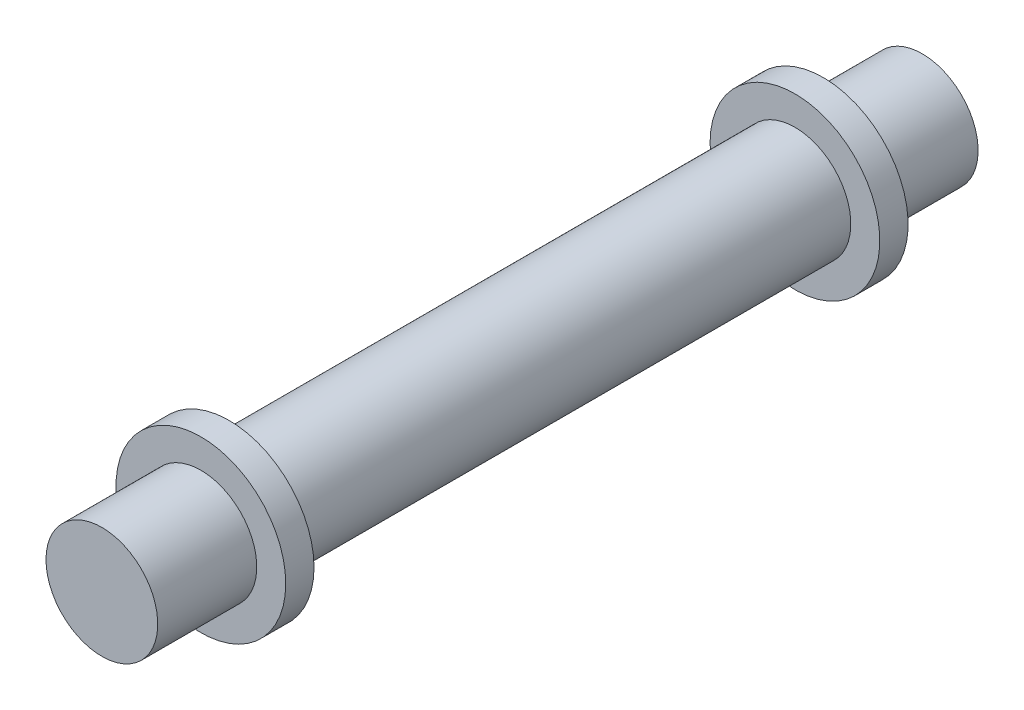
ISO-10303-21;
HEADER;
FILE_DESCRIPTION(('STEP AP214'),'2;1');
FILE_NAME('part.step','',(''),(''),'','','');
FILE_SCHEMA(('AUTOMOTIVE_DESIGN { 1 0 10303 214 1 1 1 1 }'));
ENDSEC;
DATA;
#1=APPLICATION_CONTEXT('core data for automotive mechanical design processes');
#2=APPLICATION_PROTOCOL_DEFINITION('international standard','automotive_design',2000,#1);
#3=PRODUCT_CONTEXT('',#1,'mechanical');
#4=PRODUCT('Part','Part','',(#3));
#5=PRODUCT_RELATED_PRODUCT_CATEGORY('part','',(#4));
#6=PRODUCT_DEFINITION_FORMATION('','',#4);
#7=PRODUCT_DEFINITION_CONTEXT('part definition',#1,'design');
#8=PRODUCT_DEFINITION('design','',#6,#7);
#9=PRODUCT_DEFINITION_SHAPE('','',#8);
#10=(LENGTH_UNIT() NAMED_UNIT(*) SI_UNIT(.MILLI.,.METRE.));
#11=(NAMED_UNIT(*) PLANE_ANGLE_UNIT() SI_UNIT($,.RADIAN.));
#12=(NAMED_UNIT(*) SI_UNIT($,.STERADIAN.) SOLID_ANGLE_UNIT());
#13=UNCERTAINTY_MEASURE_WITH_UNIT(LENGTH_MEASURE(1.E-05),#10,'distance_accuracy_value','');
#14=(GEOMETRIC_REPRESENTATION_CONTEXT(3) GLOBAL_UNCERTAINTY_ASSIGNED_CONTEXT((#13)) GLOBAL_UNIT_ASSIGNED_CONTEXT((#10,
#11,#12)) REPRESENTATION_CONTEXT('',''));
#15=CARTESIAN_POINT('',(0.,0.,0.));
#16=DIRECTION('',(0.,0.,1.));
#17=DIRECTION('',(1.,0.,0.));
#18=AXIS2_PLACEMENT_3D('',#15,#16,#17);
#19=CARTESIAN_POINT('',(0.,0.,58.));
#20=DIRECTION('',(0.,0.,-1.));
#21=DIRECTION('',(-1.,0.,0.));
#22=AXIS2_PLACEMENT_3D('',#19,#20,#21);
#23=CYLINDRICAL_SURFACE('',#22,3.95);
#24=CARTESIAN_POINT('',(0.,0.,49.));
#25=DIRECTION('',(0.,0.,1.));
#26=DIRECTION('',(1.,0.,0.));
#27=AXIS2_PLACEMENT_3D('',#24,#25,#26);
#28=CIRCLE('',#27,3.95);
#29=CARTESIAN_POINT('',(-3.95,0.,49.));
#30=VERTEX_POINT('',#29);
#31=EDGE_CURVE('E39',#30,#30,#28,.T.);
#32=CARTESIAN_POINT('',(0.,0.,9.));
#33=DIRECTION('',(0.,0.,-1.));
#34=DIRECTION('',(-1.,0.,0.));
#35=AXIS2_PLACEMENT_3D('',#32,#33,#34);
#36=CIRCLE('',#35,3.95);
#37=CARTESIAN_POINT('',(-3.95,0.,9.00000000000001));
#38=VERTEX_POINT('',#37);
#39=EDGE_CURVE('E10',#38,#38,#36,.T.);
#40=CARTESIAN_POINT('',(-3.95,0.,49.));
#41=CARTESIAN_POINT('',(-3.95,0.,48.5833333333333));
#42=CARTESIAN_POINT('',(-3.95,0.,48.1666666666667));
#43=CARTESIAN_POINT('',(-3.95,0.,47.3333333333333));
#44=CARTESIAN_POINT('',(-3.95,0.,46.9166666666667));
#45=CARTESIAN_POINT('',(-3.95,0.,46.0833333333333));
#46=CARTESIAN_POINT('',(-3.95,0.,45.6666666666667));
#47=CARTESIAN_POINT('',(-3.95,0.,44.8333333333333));
#48=CARTESIAN_POINT('',(-3.95,0.,44.4166666666667));
#49=CARTESIAN_POINT('',(-3.95,0.,43.5833333333333));
#50=CARTESIAN_POINT('',(-3.95,0.,43.1666666666667));
#51=CARTESIAN_POINT('',(-3.95,0.,42.3333333333333));
#52=CARTESIAN_POINT('',(-3.95,0.,41.9166666666667));
#53=CARTESIAN_POINT('',(-3.95,0.,41.0833333333333));
#54=CARTESIAN_POINT('',(-3.95,0.,40.6666666666667));
#55=CARTESIAN_POINT('',(-3.95,0.,39.8333333333333));
#56=CARTESIAN_POINT('',(-3.95,0.,39.4166666666667));
#57=CARTESIAN_POINT('',(-3.95,0.,38.5833333333333));
#58=CARTESIAN_POINT('',(-3.95,0.,38.1666666666667));
#59=CARTESIAN_POINT('',(-3.95,0.,37.3333333333333));
#60=CARTESIAN_POINT('',(-3.95,0.,36.9166666666667));
#61=CARTESIAN_POINT('',(-3.95,0.,36.0833333333333));
#62=CARTESIAN_POINT('',(-3.95,0.,35.6666666666667));
#63=CARTESIAN_POINT('',(-3.95,0.,34.8333333333333));
#64=CARTESIAN_POINT('',(-3.95,0.,34.4166666666667));
#65=CARTESIAN_POINT('',(-3.95,0.,33.5833333333333));
#66=CARTESIAN_POINT('',(-3.95,0.,33.1666666666667));
#67=CARTESIAN_POINT('',(-3.95,0.,32.3333333333333));
#68=CARTESIAN_POINT('',(-3.95,0.,31.9166666666667));
#69=CARTESIAN_POINT('',(-3.95,0.,31.0833333333333));
#70=CARTESIAN_POINT('',(-3.95,0.,30.6666666666667));
#71=CARTESIAN_POINT('',(-3.95,0.,29.8333333333333));
#72=CARTESIAN_POINT('',(-3.95,0.,29.4166666666667));
#73=CARTESIAN_POINT('',(-3.95,0.,28.5833333333333));
#74=CARTESIAN_POINT('',(-3.95,0.,28.1666666666667));
#75=CARTESIAN_POINT('',(-3.95,0.,27.3333333333333));
#76=CARTESIAN_POINT('',(-3.95,0.,26.9166666666667));
#77=CARTESIAN_POINT('',(-3.95,0.,26.0833333333333));
#78=CARTESIAN_POINT('',(-3.95,0.,25.6666666666667));
#79=CARTESIAN_POINT('',(-3.95,0.,24.8333333333333));
#80=CARTESIAN_POINT('',(-3.95,0.,24.4166666666667));
#81=CARTESIAN_POINT('',(-3.95,0.,23.5833333333333));
#82=CARTESIAN_POINT('',(-3.95,0.,23.1666666666667));
#83=CARTESIAN_POINT('',(-3.95,0.,22.3333333333333));
#84=CARTESIAN_POINT('',(-3.95,0.,21.9166666666667));
#85=CARTESIAN_POINT('',(-3.95,0.,21.0833333333333));
#86=CARTESIAN_POINT('',(-3.95,0.,20.6666666666667));
#87=CARTESIAN_POINT('',(-3.95,0.,19.8333333333333));
#88=CARTESIAN_POINT('',(-3.95,0.,19.4166666666667));
#89=CARTESIAN_POINT('',(-3.95,0.,18.5833333333333));
#90=CARTESIAN_POINT('',(-3.95,0.,18.1666666666667));
#91=CARTESIAN_POINT('',(-3.95,0.,17.3333333333333));
#92=CARTESIAN_POINT('',(-3.95,0.,16.9166666666667));
#93=CARTESIAN_POINT('',(-3.95,0.,16.0833333333333));
#94=CARTESIAN_POINT('',(-3.95,0.,15.6666666666667));
#95=CARTESIAN_POINT('',(-3.95,0.,14.8333333333333));
#96=CARTESIAN_POINT('',(-3.95,0.,14.4166666666667));
#97=CARTESIAN_POINT('',(-3.95,0.,13.5833333333333));
#98=CARTESIAN_POINT('',(-3.95,0.,13.1666666666667));
#99=CARTESIAN_POINT('',(-3.95,0.,12.3333333333333));
#100=CARTESIAN_POINT('',(-3.95,0.,11.9166666666667));
#101=CARTESIAN_POINT('',(-3.95,0.,11.0833333333333));
#102=CARTESIAN_POINT('',(-3.95,0.,10.6666666666667));
#103=CARTESIAN_POINT('',(-3.95,0.,9.83333333333334));
#104=CARTESIAN_POINT('',(-3.95,0.,9.41666666666667));
#105=CARTESIAN_POINT('',(-3.95,0.,9.00000000000001));
#106=B_SPLINE_CURVE_WITH_KNOTS('',3,(#40,#41,#42,#43,#44,#45,#46,#47,#48,#49,#50,#51,#52,#53,
#54,#55,#56,#57,#58,#59,#60,#61,#62,#63,#64,#65,#66,#67,#68,#69,#70,#71,#72,#73,#74,#75,#76,#77,
#78,#79,#80,#81,#82,#83,#84,#85,#86,#87,#88,#89,#90,#91,#92,#93,#94,#95,#96,#97,#98,#99,#100,
#101,#102,#103,#104,#105),.UNSPECIFIED.,.F.,.F.,(4,2,2,2,2,2,2,2,2,2,2,2,2,2,2,2,2,2,2,2,2,2,2,
2,2,2,2,2,2,2,2,2,4),(0.,1.24999999999999,2.5,3.75,5.,6.25,7.5,8.75,9.99999999999999,11.25,12.5,
13.75,15.,16.25,17.5,18.75,20.,21.25,22.5,23.75,25.,26.25,27.5,28.75,30.,31.25,32.5,33.75,35.,
36.25,37.5,38.75,40.),.UNSPECIFIED.);
#107=EDGE_CURVE('BSEAM32',#30,#38,#106,.T.);
#108=ORIENTED_EDGE('',*,*,#31,.F.);
#109=ORIENTED_EDGE('',*,*,#39,.F.);
#110=ORIENTED_EDGE('',*,*,#107,.T.);
#111=ORIENTED_EDGE('',*,*,#107,.F.);
#112=EDGE_LOOP('',(#108,#110,#109,#111));
#113=FACE_BOUND('',#112,.T.);
#114=ADVANCED_FACE('F32',(#113),#23,.T.);
#115=CARTESIAN_POINT('',(0.,0.,49.));
#116=DIRECTION('',(0.,0.,1.));
#117=DIRECTION('',(1.,0.,0.));
#118=AXIS2_PLACEMENT_3D('',#115,#116,#117);
#119=CYLINDRICAL_SURFACE('',#118,6.);
#120=CARTESIAN_POINT('',(0.,0.,49.));
#121=DIRECTION('',(0.,0.,1.));
#122=DIRECTION('',(1.,0.,0.));
#123=AXIS2_PLACEMENT_3D('',#120,#121,#122);
#124=CIRCLE('',#123,6.);
#125=CARTESIAN_POINT('',(6.,0.,49.));
#126=VERTEX_POINT('',#125);
#127=EDGE_CURVE('E60',#126,#126,#124,.T.);
#128=ORIENTED_EDGE('',*,*,#127,.T.);
#129=EDGE_LOOP('',(#128));
#130=FACE_BOUND('',#129,.T.);
#131=CARTESIAN_POINT('',(0.,0.,51.));
#132=DIRECTION('',(0.,0.,1.));
#133=DIRECTION('',(1.,0.,0.));
#134=AXIS2_PLACEMENT_3D('',#131,#132,#133);
#135=CIRCLE('',#134,6.);
#136=CARTESIAN_POINT('',(6.,0.,51.));
#137=VERTEX_POINT('',#136);
#138=EDGE_CURVE('E55',#137,#137,#135,.T.);
#139=ORIENTED_EDGE('',*,*,#138,.F.);
#140=EDGE_LOOP('',(#139));
#141=FACE_BOUND('',#140,.T.);
#142=ADVANCED_FACE('F87',(#130,#141),#119,.T.);
#143=CARTESIAN_POINT('',(0.,0.,49.));
#144=DIRECTION('',(0.,0.,1.));
#145=DIRECTION('',(1.,0.,0.));
#146=AXIS2_PLACEMENT_3D('',#143,#144,#145);
#147=PLANE('',#146);
#148=ORIENTED_EDGE('',*,*,#31,.T.);
#149=EDGE_LOOP('',(#148));
#150=FACE_BOUND('',#149,.T.);
#151=ORIENTED_EDGE('',*,*,#127,.F.);
#152=EDGE_LOOP('',(#151));
#153=FACE_BOUND('',#152,.T.);
#154=ADVANCED_FACE('F83',(#150,#153),#147,.F.);
#155=CARTESIAN_POINT('',(0.,0.,51.));
#156=DIRECTION('',(0.,0.,1.));
#157=DIRECTION('',(1.,0.,0.));
#158=AXIS2_PLACEMENT_3D('',#155,#156,#157);
#159=PLANE('',#158);
#160=CARTESIAN_POINT('',(0.,0.,51.));
#161=DIRECTION('',(0.,0.,1.));
#162=DIRECTION('',(1.,0.,0.));
#163=AXIS2_PLACEMENT_3D('',#160,#161,#162);
#164=CIRCLE('',#163,3.95);
#165=CARTESIAN_POINT('',(-3.95,0.,51.));
#166=VERTEX_POINT('',#165);
#167=EDGE_CURVE('E51',#166,#166,#164,.T.);
#168=ORIENTED_EDGE('',*,*,#167,.F.);
#169=EDGE_LOOP('',(#168));
#170=FACE_BOUND('',#169,.T.);
#171=ORIENTED_EDGE('',*,*,#138,.T.);
#172=EDGE_LOOP('',(#171));
#173=FACE_BOUND('',#172,.T.);
#174=ADVANCED_FACE('F79',(#170,#173),#159,.T.);
#175=CARTESIAN_POINT('',(0.,0.,58.));
#176=DIRECTION('',(0.,0.,1.));
#177=DIRECTION('',(1.,0.,0.));
#178=AXIS2_PLACEMENT_3D('',#175,#176,#177);
#179=PLANE('',#178);
#180=CARTESIAN_POINT('',(0.,0.,58.));
#181=DIRECTION('',(0.,0.,1.));
#182=DIRECTION('',(1.,0.,0.));
#183=AXIS2_PLACEMENT_3D('',#180,#181,#182);
#184=CIRCLE('',#183,3.95);
#185=CARTESIAN_POINT('',(-3.95,0.,58.));
#186=VERTEX_POINT('',#185);
#187=EDGE_CURVE('E43',#186,#186,#184,.T.);
#188=ORIENTED_EDGE('',*,*,#187,.T.);
#189=EDGE_LOOP('',(#188));
#190=FACE_BOUND('',#189,.T.);
#191=ADVANCED_FACE('F82',(#190),#179,.T.);
#192=CARTESIAN_POINT('',(-3.95,0.,51.));
#193=CARTESIAN_POINT('',(-3.95,0.,51.0729166666667));
#194=CARTESIAN_POINT('',(-3.95,0.,51.1458333333333));
#195=CARTESIAN_POINT('',(-3.95,0.,51.2916666666667));
#196=CARTESIAN_POINT('',(-3.95,0.,51.3645833333333));
#197=CARTESIAN_POINT('',(-3.95,0.,51.5104166666667));
#198=CARTESIAN_POINT('',(-3.95,0.,51.5833333333333));
#199=CARTESIAN_POINT('',(-3.95,0.,51.7291666666667));
#200=CARTESIAN_POINT('',(-3.95,0.,51.8020833333333));
#201=CARTESIAN_POINT('',(-3.95,0.,51.9479166666667));
#202=CARTESIAN_POINT('',(-3.95,0.,52.0208333333333));
#203=CARTESIAN_POINT('',(-3.95,0.,52.1666666666667));
#204=CARTESIAN_POINT('',(-3.95,0.,52.2395833333333));
#205=CARTESIAN_POINT('',(-3.95,0.,52.3854166666667));
#206=CARTESIAN_POINT('',(-3.95,0.,52.4583333333333));
#207=CARTESIAN_POINT('',(-3.95,0.,52.6041666666667));
#208=CARTESIAN_POINT('',(-3.95,0.,52.6770833333333));
#209=CARTESIAN_POINT('',(-3.95,0.,52.8229166666667));
#210=CARTESIAN_POINT('',(-3.95,0.,52.8958333333333));
#211=CARTESIAN_POINT('',(-3.95,0.,53.0416666666667));
#212=CARTESIAN_POINT('',(-3.95,0.,53.1145833333333));
#213=CARTESIAN_POINT('',(-3.95,0.,53.2604166666667));
#214=CARTESIAN_POINT('',(-3.95,0.,53.3333333333333));
#215=CARTESIAN_POINT('',(-3.95,0.,53.4791666666667));
#216=CARTESIAN_POINT('',(-3.95,0.,53.5520833333333));
#217=CARTESIAN_POINT('',(-3.95,0.,53.6979166666667));
#218=CARTESIAN_POINT('',(-3.95,0.,53.7708333333333));
#219=CARTESIAN_POINT('',(-3.95,0.,53.9166666666667));
#220=CARTESIAN_POINT('',(-3.95,0.,53.9895833333333));
#221=CARTESIAN_POINT('',(-3.95,0.,54.1354166666667));
#222=CARTESIAN_POINT('',(-3.95,0.,54.2083333333333));
#223=CARTESIAN_POINT('',(-3.95,0.,54.3541666666667));
#224=CARTESIAN_POINT('',(-3.95,0.,54.4270833333333));
#225=CARTESIAN_POINT('',(-3.95,0.,54.5729166666667));
#226=CARTESIAN_POINT('',(-3.95,0.,54.6458333333333));
#227=CARTESIAN_POINT('',(-3.95,0.,54.7916666666667));
#228=CARTESIAN_POINT('',(-3.95,0.,54.8645833333333));
#229=CARTESIAN_POINT('',(-3.95,0.,55.0104166666667));
#230=CARTESIAN_POINT('',(-3.95,0.,55.0833333333333));
#231=CARTESIAN_POINT('',(-3.95,0.,55.2291666666667));
#232=CARTESIAN_POINT('',(-3.95,0.,55.3020833333333));
#233=CARTESIAN_POINT('',(-3.95,0.,55.4479166666667));
#234=CARTESIAN_POINT('',(-3.95,0.,55.5208333333333));
#235=CARTESIAN_POINT('',(-3.95,0.,55.6666666666667));
#236=CARTESIAN_POINT('',(-3.95,0.,55.7395833333333));
#237=CARTESIAN_POINT('',(-3.95,0.,55.8854166666667));
#238=CARTESIAN_POINT('',(-3.95,0.,55.9583333333333));
#239=CARTESIAN_POINT('',(-3.95,0.,56.1041666666667));
#240=CARTESIAN_POINT('',(-3.95,0.,56.1770833333333));
#241=CARTESIAN_POINT('',(-3.95,0.,56.3229166666667));
#242=CARTESIAN_POINT('',(-3.95,0.,56.3958333333333));
#243=CARTESIAN_POINT('',(-3.95,0.,56.5416666666667));
#244=CARTESIAN_POINT('',(-3.95,0.,56.6145833333333));
#245=CARTESIAN_POINT('',(-3.95,0.,56.7604166666667));
#246=CARTESIAN_POINT('',(-3.95,0.,56.8333333333333));
#247=CARTESIAN_POINT('',(-3.95,0.,56.9791666666667));
#248=CARTESIAN_POINT('',(-3.95,0.,57.0520833333333));
#249=CARTESIAN_POINT('',(-3.95,0.,57.1979166666667));
#250=CARTESIAN_POINT('',(-3.95,0.,57.2708333333333));
#251=CARTESIAN_POINT('',(-3.95,0.,57.4166666666667));
#252=CARTESIAN_POINT('',(-3.95,0.,57.4895833333333));
#253=CARTESIAN_POINT('',(-3.95,0.,57.6354166666667));
#254=CARTESIAN_POINT('',(-3.95,0.,57.7083333333333));
#255=CARTESIAN_POINT('',(-3.95,0.,57.8541666666667));
#256=CARTESIAN_POINT('',(-3.95,0.,57.9270833333333));
#257=CARTESIAN_POINT('',(-3.95,0.,58.));
#258=B_SPLINE_CURVE_WITH_KNOTS('',3,(#192,#193,#194,#195,#196,#197,#198,#199,#200,#201,#202,
#203,#204,#205,#206,#207,#208,#209,#210,#211,#212,#213,#214,#215,#216,#217,#218,#219,#220,#221,
#222,#223,#224,#225,#226,#227,#228,#229,#230,#231,#232,#233,#234,#235,#236,#237,#238,#239,#240,
#241,#242,#243,#244,#245,#246,#247,#248,#249,#250,#251,#252,#253,#254,#255,#256,#257),
.UNSPECIFIED.,.F.,.F.,(4,2,2,2,2,2,2,2,2,2,2,2,2,2,2,2,2,2,2,2,2,2,2,2,2,2,2,2,2,2,2,2,4),(0.,
0.218750000000004,0.4375,0.656250000000004,0.875000000000001,1.09375,1.3125,1.53125,1.75,
1.96875000000001,2.1875,2.40625000000001,2.625,2.84375000000001,3.0625,3.28125,3.5,3.71875,
3.9375,4.15625,4.375,4.59375,4.8125,5.03125,5.25,5.46875,5.68750000000001,5.90625,
6.12500000000001,6.34375,6.56250000000001,6.78125,7.00000000000001),.UNSPECIFIED.);
#259=EDGE_CURVE('BSEAM34',#166,#186,#258,.T.);
#260=ORIENTED_EDGE('',*,*,#167,.T.);
#261=ORIENTED_EDGE('',*,*,#187,.F.);
#262=ORIENTED_EDGE('',*,*,#259,.T.);
#263=ORIENTED_EDGE('',*,*,#259,.F.);
#264=EDGE_LOOP('',(#260,#262,#261,#263));
#265=FACE_BOUND('',#264,.T.);
#266=ADVANCED_FACE('F34',(#265),#23,.T.);
#267=CARTESIAN_POINT('',(0.,0.,9.));
#268=DIRECTION('',(0.,0.,-1.));
#269=DIRECTION('',(-1.,0.,0.));
#270=AXIS2_PLACEMENT_3D('',#267,#268,#269);
#271=CYLINDRICAL_SURFACE('',#270,6.);
#272=CARTESIAN_POINT('',(0.,0.,9.));
#273=DIRECTION('',(0.,0.,-1.));
#274=DIRECTION('',(-1.,0.,0.));
#275=AXIS2_PLACEMENT_3D('',#272,#273,#274);
#276=CIRCLE('',#275,6.);
#277=CARTESIAN_POINT('',(-6.,0.,9.));
#278=VERTEX_POINT('',#277);
#279=EDGE_CURVE('E56',#278,#278,#276,.T.);
#280=ORIENTED_EDGE('',*,*,#279,.T.);
#281=EDGE_LOOP('',(#280));
#282=FACE_BOUND('',#281,.T.);
#283=CARTESIAN_POINT('',(0.,0.,7.));
#284=DIRECTION('',(0.,0.,-1.));
#285=DIRECTION('',(-1.,0.,0.));
#286=AXIS2_PLACEMENT_3D('',#283,#284,#285);
#287=CIRCLE('',#286,6.);
#288=CARTESIAN_POINT('',(-6.,0.,7.));
#289=VERTEX_POINT('',#288);
#290=EDGE_CURVE('E63',#289,#289,#287,.T.);
#291=ORIENTED_EDGE('',*,*,#290,.F.);
#292=EDGE_LOOP('',(#291));
#293=FACE_BOUND('',#292,.T.);
#294=ADVANCED_FACE('F115',(#282,#293),#271,.T.);
#295=CARTESIAN_POINT('',(0.,0.,9.));
#296=DIRECTION('',(0.,0.,-1.));
#297=DIRECTION('',(-1.,0.,0.));
#298=AXIS2_PLACEMENT_3D('',#295,#296,#297);
#299=PLANE('',#298);
#300=ORIENTED_EDGE('',*,*,#39,.T.);
#301=EDGE_LOOP('',(#300));
#302=FACE_BOUND('',#301,.T.);
#303=ORIENTED_EDGE('',*,*,#279,.F.);
#304=EDGE_LOOP('',(#303));
#305=FACE_BOUND('',#304,.T.);
#306=ADVANCED_FACE('F109',(#302,#305),#299,.F.);
#307=CARTESIAN_POINT('',(0.,0.,7.));
#308=DIRECTION('',(0.,0.,-1.));
#309=DIRECTION('',(-1.,0.,0.));
#310=AXIS2_PLACEMENT_3D('',#307,#308,#309);
#311=PLANE('',#310);
#312=CARTESIAN_POINT('',(0.,0.,7.));
#313=DIRECTION('',(0.,0.,-1.));
#314=DIRECTION('',(-1.,0.,0.));
#315=AXIS2_PLACEMENT_3D('',#312,#313,#314);
#316=CIRCLE('',#315,3.95);
#317=CARTESIAN_POINT('',(-3.95,0.,7.00000000000001));
#318=VERTEX_POINT('',#317);
#319=EDGE_CURVE('E53',#318,#318,#316,.T.);
#320=ORIENTED_EDGE('',*,*,#319,.F.);
#321=EDGE_LOOP('',(#320));
#322=FACE_BOUND('',#321,.T.);
#323=ORIENTED_EDGE('',*,*,#290,.T.);
#324=EDGE_LOOP('',(#323));
#325=FACE_BOUND('',#324,.T.);
#326=ADVANCED_FACE('F103',(#322,#325),#311,.T.);
#327=CARTESIAN_POINT('',(0.,0.,0.));
#328=DIRECTION('',(0.,0.,1.));
#329=DIRECTION('',(1.,0.,0.));
#330=AXIS2_PLACEMENT_3D('',#327,#328,#329);
#331=PLANE('',#330);
#332=CARTESIAN_POINT('',(0.,0.,0.));
#333=DIRECTION('',(0.,0.,1.));
#334=DIRECTION('',(1.,0.,0.));
#335=AXIS2_PLACEMENT_3D('',#332,#333,#334);
#336=CIRCLE('',#335,3.95);
#337=CARTESIAN_POINT('',(-3.95,0.,0.));
#338=VERTEX_POINT('',#337);
#339=EDGE_CURVE('E48',#338,#338,#336,.T.);
#340=ORIENTED_EDGE('',*,*,#339,.F.);
#341=EDGE_LOOP('',(#340));
#342=FACE_BOUND('',#341,.T.);
#343=ADVANCED_FACE('F101',(#342),#331,.F.);
#344=CARTESIAN_POINT('',(-3.95,0.,7.00000000000001));
#345=CARTESIAN_POINT('',(-3.95,0.,6.92708333333334));
#346=CARTESIAN_POINT('',(-3.95,0.,6.85416666666667));
#347=CARTESIAN_POINT('',(-3.95,0.,6.70833333333334));
#348=CARTESIAN_POINT('',(-3.95,0.,6.63541666666667));
#349=CARTESIAN_POINT('',(-3.95,0.,6.48958333333334));
#350=CARTESIAN_POINT('',(-3.95,0.,6.41666666666667));
#351=CARTESIAN_POINT('',(-3.95,0.,6.27083333333334));
#352=CARTESIAN_POINT('',(-3.95,0.,6.19791666666667));
#353=CARTESIAN_POINT('',(-3.95,0.,6.05208333333334));
#354=CARTESIAN_POINT('',(-3.95,0.,5.97916666666667));
#355=CARTESIAN_POINT('',(-3.95,0.,5.83333333333334));
#356=CARTESIAN_POINT('',(-3.95,0.,5.76041666666667));
#357=CARTESIAN_POINT('',(-3.95,0.,5.61458333333334));
#358=CARTESIAN_POINT('',(-3.95,0.,5.54166666666667));
#359=CARTESIAN_POINT('',(-3.95,0.,5.39583333333334));
#360=CARTESIAN_POINT('',(-3.95,0.,5.32291666666667));
#361=CARTESIAN_POINT('',(-3.95,0.,5.17708333333334));
#362=CARTESIAN_POINT('',(-3.95,0.,5.10416666666667));
#363=CARTESIAN_POINT('',(-3.95,0.,4.95833333333334));
#364=CARTESIAN_POINT('',(-3.95,0.,4.88541666666667));
#365=CARTESIAN_POINT('',(-3.95,0.,4.73958333333334));
#366=CARTESIAN_POINT('',(-3.95,0.,4.66666666666667));
#367=CARTESIAN_POINT('',(-3.95,0.,4.52083333333334));
#368=CARTESIAN_POINT('',(-3.95,0.,4.44791666666667));
#369=CARTESIAN_POINT('',(-3.95,0.,4.30208333333334));
#370=CARTESIAN_POINT('',(-3.95,0.,4.22916666666667));
#371=CARTESIAN_POINT('',(-3.95,0.,4.08333333333333));
#372=CARTESIAN_POINT('',(-3.95,0.,4.01041666666667));
#373=CARTESIAN_POINT('',(-3.95,0.,3.86458333333334));
#374=CARTESIAN_POINT('',(-3.95,0.,3.79166666666667));
#375=CARTESIAN_POINT('',(-3.95,0.,3.64583333333334));
#376=CARTESIAN_POINT('',(-3.95,0.,3.57291666666667));
#377=CARTESIAN_POINT('',(-3.95,0.,3.42708333333334));
#378=CARTESIAN_POINT('',(-3.95,0.,3.35416666666667));
#379=CARTESIAN_POINT('',(-3.95,0.,3.20833333333333));
#380=CARTESIAN_POINT('',(-3.95,0.,3.13541666666667));
#381=CARTESIAN_POINT('',(-3.95,0.,2.98958333333334));
#382=CARTESIAN_POINT('',(-3.95,0.,2.91666666666667));
#383=CARTESIAN_POINT('',(-3.95,0.,2.77083333333334));
#384=CARTESIAN_POINT('',(-3.95,0.,2.69791666666667));
#385=CARTESIAN_POINT('',(-3.95,0.,2.55208333333333));
#386=CARTESIAN_POINT('',(-3.95,0.,2.47916666666667));
#387=CARTESIAN_POINT('',(-3.95,0.,2.33333333333333));
#388=CARTESIAN_POINT('',(-3.95,0.,2.26041666666667));
#389=CARTESIAN_POINT('',(-3.95,0.,2.11458333333334));
#390=CARTESIAN_POINT('',(-3.95,0.,2.04166666666667));
#391=CARTESIAN_POINT('',(-3.95,0.,1.89583333333334));
#392=CARTESIAN_POINT('',(-3.95,0.,1.82291666666667));
#393=CARTESIAN_POINT('',(-3.95,0.,1.67708333333333));
#394=CARTESIAN_POINT('',(-3.95,0.,1.60416666666667));
#395=CARTESIAN_POINT('',(-3.95,0.,1.45833333333333));
#396=CARTESIAN_POINT('',(-3.95,0.,1.38541666666667));
#397=CARTESIAN_POINT('',(-3.95,0.,1.23958333333334));
#398=CARTESIAN_POINT('',(-3.95,0.,1.16666666666667));
#399=CARTESIAN_POINT('',(-3.95,0.,1.02083333333334));
#400=CARTESIAN_POINT('',(-3.95,0.,0.947916666666669));
#401=CARTESIAN_POINT('',(-3.95,0.,0.802083333333333));
#402=CARTESIAN_POINT('',(-3.95,0.,0.729166666666665));
#403=CARTESIAN_POINT('',(-3.95,0.,0.583333333333331));
#404=CARTESIAN_POINT('',(-3.95,0.,0.510416666666666));
#405=CARTESIAN_POINT('',(-3.95,0.,0.364583333333335));
#406=CARTESIAN_POINT('',(-3.95,0.,0.291666666666669));
#407=CARTESIAN_POINT('',(-3.95,0.,0.145833333333336));
#408=CARTESIAN_POINT('',(-3.95,0.,0.0729166666666679));
#409=CARTESIAN_POINT('',(-3.95,0.,0.));
#410=B_SPLINE_CURVE_WITH_KNOTS('',3,(#344,#345,#346,#347,#348,#349,#350,#351,#352,#353,#354,
#355,#356,#357,#358,#359,#360,#361,#362,#363,#364,#365,#366,#367,#368,#369,#370,#371,#372,#373,
#374,#375,#376,#377,#378,#379,#380,#381,#382,#383,#384,#385,#386,#387,#388,#389,#390,#391,#392,
#393,#394,#395,#396,#397,#398,#399,#400,#401,#402,#403,#404,#405,#406,#407,#408,#409),
.UNSPECIFIED.,.F.,.F.,(4,2,2,2,2,2,2,2,2,2,2,2,2,2,2,2,2,2,2,2,2,2,2,2,2,2,2,2,2,2,2,2,4),(0.,
0.218750000000004,0.4375,0.656249999999997,0.875000000000001,1.09375,1.3125,1.53125,1.75,
1.96875000000001,2.1875,2.40625,2.625,2.84375000000001,3.0625,3.28125,3.5,3.71875000000001,
3.9375,4.15625,4.375,4.59375000000001,4.8125,5.03125,5.25,5.46875000000001,5.68750000000001,
5.90625,6.12500000000001,6.34375000000001,6.56250000000001,6.78125,7.00000000000001),.UNSPECIFIED.);
#411=EDGE_CURVE('BSEAM97',#318,#338,#410,.T.);
#412=ORIENTED_EDGE('',*,*,#319,.T.);
#413=ORIENTED_EDGE('',*,*,#339,.T.);
#414=ORIENTED_EDGE('',*,*,#411,.T.);
#415=ORIENTED_EDGE('',*,*,#411,.F.);
#416=EDGE_LOOP('',(#412,#414,#413,#415));
#417=FACE_BOUND('',#416,.T.);
#418=ADVANCED_FACE('F97',(#417),#23,.T.);
#419=CLOSED_SHELL('',(#114,#142,#154,#174,#191,#266,#294,#306,#326,#343,#418));
#420=MANIFOLD_SOLID_BREP('B2',#419);
#421=ADVANCED_BREP_SHAPE_REPRESENTATION('',(#18,#420),#14);
#422=SHAPE_DEFINITION_REPRESENTATION(#9,#421);
ENDSEC;
END-ISO-10303-21;
